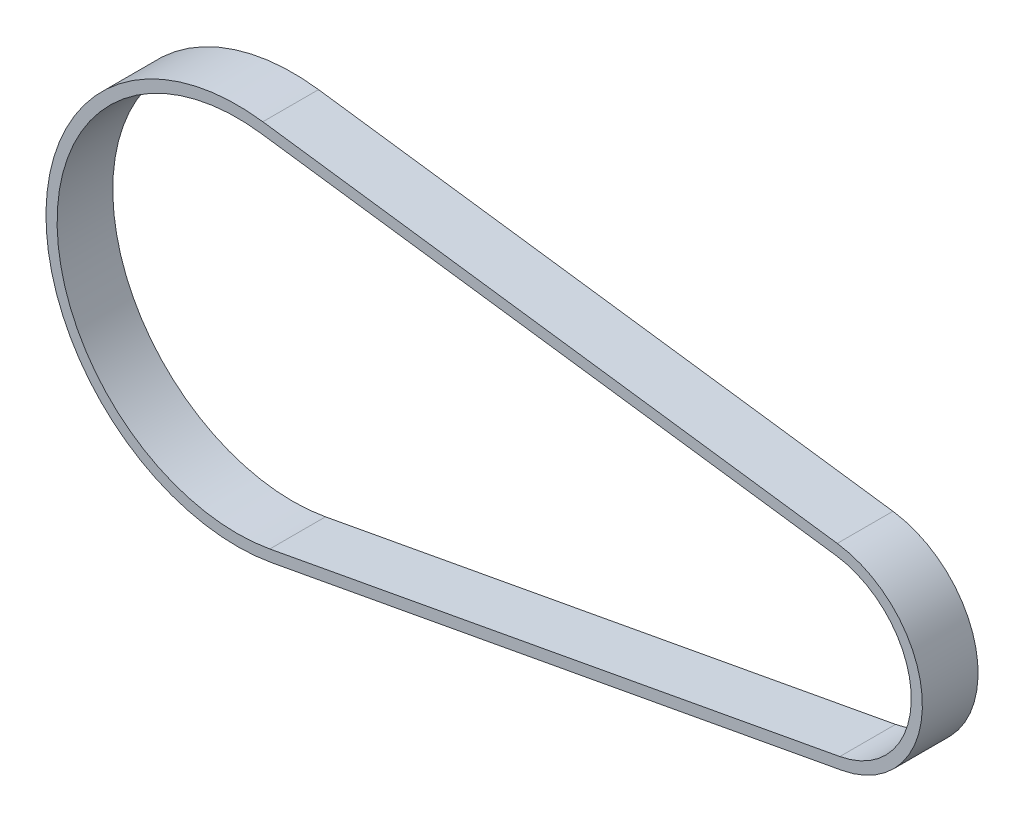
ISO-10303-21;
HEADER;
FILE_DESCRIPTION(('STEP AP214'),'2;1');
FILE_NAME('part.step','',(''),(''),'','','');
FILE_SCHEMA(('AUTOMOTIVE_DESIGN { 1 0 10303 214 1 1 1 1 }'));
ENDSEC;
DATA;
#1=APPLICATION_CONTEXT('core data for automotive mechanical design processes');
#2=APPLICATION_PROTOCOL_DEFINITION('international standard','automotive_design',2000,#1);
#3=PRODUCT_CONTEXT('',#1,'mechanical');
#4=PRODUCT('Part','Part','',(#3));
#5=PRODUCT_RELATED_PRODUCT_CATEGORY('part','',(#4));
#6=PRODUCT_DEFINITION_FORMATION('','',#4);
#7=PRODUCT_DEFINITION_CONTEXT('part definition',#1,'design');
#8=PRODUCT_DEFINITION('design','',#6,#7);
#9=PRODUCT_DEFINITION_SHAPE('','',#8);
#10=(LENGTH_UNIT() NAMED_UNIT(*) SI_UNIT(.MILLI.,.METRE.));
#11=(NAMED_UNIT(*) PLANE_ANGLE_UNIT() SI_UNIT($,.RADIAN.));
#12=(NAMED_UNIT(*) SI_UNIT($,.STERADIAN.) SOLID_ANGLE_UNIT());
#13=UNCERTAINTY_MEASURE_WITH_UNIT(LENGTH_MEASURE(1.E-05),#10,'distance_accuracy_value','');
#14=(GEOMETRIC_REPRESENTATION_CONTEXT(3) GLOBAL_UNCERTAINTY_ASSIGNED_CONTEXT((#13)) GLOBAL_UNIT_ASSIGNED_CONTEXT((#10,
#11,#12)) REPRESENTATION_CONTEXT('',''));
#15=CARTESIAN_POINT('',(0.,0.,0.));
#16=DIRECTION('',(0.,0.,1.));
#17=DIRECTION('',(1.,0.,0.));
#18=AXIS2_PLACEMENT_3D('',#15,#16,#17);
#19=CARTESIAN_POINT('',(158.094484339544,3.76760186596419,-7.5));
#20=DIRECTION('',(0.,0.,1.));
#21=DIRECTION('',(1.,0.,0.));
#22=AXIS2_PLACEMENT_3D('',#19,#20,#21);
#23=CYLINDRICAL_SURFACE('',#22,26.5);
#24=DIRECTION('',(0.,0.,1.));
#25=VECTOR('',#24,1.);
#26=CARTESIAN_POINT('',(161.65922604677,30.0267453508679,-7.5));
#27=LINE('',#26,#25);
#28=CARTESIAN_POINT('',(161.65922604677,30.0267453508679,-7.5));
#29=VERTEX_POINT('',#28);
#30=CARTESIAN_POINT('',(161.65922604677,30.0267453508679,7.5));
#31=VERTEX_POINT('',#30);
#32=EDGE_CURVE('E38',#29,#31,#27,.T.);
#33=ORIENTED_EDGE('',*,*,#32,.T.);
#34=CARTESIAN_POINT('',(158.094484339544,3.76760186596419,7.5));
#35=DIRECTION('',(0.,0.,1.));
#36=DIRECTION('',(1.,0.,0.));
#37=AXIS2_PLACEMENT_3D('',#34,#35,#36);
#38=CIRCLE('',#37,26.5);
#39=CARTESIAN_POINT('',(162.906049512127,-22.2919230834663,7.5));
#40=VERTEX_POINT('',#39);
#41=EDGE_CURVE('E130',#40,#31,#38,.T.);
#42=ORIENTED_EDGE('',*,*,#41,.F.);
#43=DIRECTION('',(0.,0.,1.));
#44=VECTOR('',#43,1.);
#45=CARTESIAN_POINT('',(162.906049512127,-22.2919230834663,-7.5));
#46=LINE('',#45,#44);
#47=CARTESIAN_POINT('',(162.906049512127,-22.2919230834663,-7.5));
#48=VERTEX_POINT('',#47);
#49=EDGE_CURVE('E11',#48,#40,#46,.T.);
#50=ORIENTED_EDGE('',*,*,#49,.F.);
#51=CARTESIAN_POINT('',(158.094484339544,3.76760186596419,-7.5));
#52=DIRECTION('',(0.,0.,1.));
#53=DIRECTION('',(1.,0.,0.));
#54=AXIS2_PLACEMENT_3D('',#51,#52,#53);
#55=CIRCLE('',#54,26.5);
#56=EDGE_CURVE('E149',#48,#29,#55,.T.);
#57=ORIENTED_EDGE('',*,*,#56,.T.);
#58=EDGE_LOOP('',(#33,#42,#50,#57));
#59=FACE_BOUND('',#58,.T.);
#60=ADVANCED_FACE('F35',(#59),#23,.T.);
#61=CARTESIAN_POINT('',(9.35077759954806,-50.6439824488931,-7.5));
#62=DIRECTION('',(0.181568497078603,-0.983378299978506,0.));
#63=DIRECTION('',(0.983378299978507,0.181568497078603,0.));
#64=AXIS2_PLACEMENT_3D('',#61,#62,#63);
#65=PLANE('',#64);
#66=ORIENTED_EDGE('',*,*,#49,.T.);
#67=DIRECTION('',(0.983378299978506,0.181568497078603,0.));
#68=VECTOR('',#67,1.);
#69=CARTESIAN_POINT('',(9.35077759954806,-50.6439824488931,7.5));
#70=LINE('',#69,#68);
#71=CARTESIAN_POINT('',(9.35077759954805,-50.6439824488931,7.5));
#72=VERTEX_POINT('',#71);
#73=EDGE_CURVE('E139',#72,#40,#70,.T.);
#74=ORIENTED_EDGE('',*,*,#73,.F.);
#75=DIRECTION('',(0.,0.,1.));
#76=VECTOR('',#75,1.);
#77=CARTESIAN_POINT('',(9.35077759954805,-50.6439824488931,-7.5));
#78=LINE('',#77,#76);
#79=CARTESIAN_POINT('',(9.35077759954805,-50.6439824488931,-7.5));
#80=VERTEX_POINT('',#79);
#81=EDGE_CURVE('E43',#80,#72,#78,.T.);
#82=ORIENTED_EDGE('',*,*,#81,.F.);
#83=DIRECTION('',(0.983378299978506,0.181568497078603,0.));
#84=VECTOR('',#83,1.);
#85=CARTESIAN_POINT('',(9.35077759954806,-50.6439824488931,-7.5));
#86=LINE('',#85,#84);
#87=EDGE_CURVE('E160',#80,#48,#86,.T.);
#88=ORIENTED_EDGE('',*,*,#87,.T.);
#89=EDGE_LOOP('',(#66,#74,#82,#88));
#90=FACE_BOUND('',#89,.T.);
#91=ADVANCED_FACE('F172',(#90),#65,.T.);
#92=CARTESIAN_POINT('',(0.,0.,-7.5));
#93=DIRECTION('',(0.,0.,1.));
#94=DIRECTION('',(1.,0.,0.));
#95=AXIS2_PLACEMENT_3D('',#92,#93,#94);
#96=CYLINDRICAL_SURFACE('',#95,51.5);
#97=ORIENTED_EDGE('',*,*,#81,.T.);
#98=CARTESIAN_POINT('',(0.,0.,7.5));
#99=DIRECTION('',(0.,0.,1.));
#100=DIRECTION('',(1.,0.,0.));
#101=AXIS2_PLACEMENT_3D('',#98,#99,#100);
#102=CIRCLE('',#101,51.5);
#103=CARTESIAN_POINT('',(6.9277055819687,51.0319203574543,7.5));
#104=VERTEX_POINT('',#103);
#105=EDGE_CURVE('E136',#104,#72,#102,.T.);
#106=ORIENTED_EDGE('',*,*,#105,.F.);
#107=DIRECTION('',(0.,0.,1.));
#108=VECTOR('',#107,1.);
#109=CARTESIAN_POINT('',(6.9277055819687,51.0319203574543,-7.5));
#110=LINE('',#109,#108);
#111=CARTESIAN_POINT('',(6.9277055819687,51.0319203574543,-7.5));
#112=VERTEX_POINT('',#111);
#113=EDGE_CURVE('E163',#112,#104,#110,.T.);
#114=ORIENTED_EDGE('',*,*,#113,.F.);
#115=CARTESIAN_POINT('',(0.,0.,-7.5));
#116=DIRECTION('',(0.,0.,1.));
#117=DIRECTION('',(1.,0.,0.));
#118=AXIS2_PLACEMENT_3D('',#115,#116,#117);
#119=CIRCLE('',#118,51.5);
#120=EDGE_CURVE('E157',#112,#80,#119,.T.);
#121=ORIENTED_EDGE('',*,*,#120,.T.);
#122=EDGE_LOOP('',(#97,#106,#114,#121));
#123=FACE_BOUND('',#122,.T.);
#124=ADVANCED_FACE('F178',(#123),#96,.T.);
#125=CARTESIAN_POINT('',(161.65922604677,30.0267453508679,-7.5));
#126=DIRECTION('',(0.134518554989683,0.990911074902025,0.));
#127=DIRECTION('',(-0.990911074902026,0.134518554989683,0.));
#128=AXIS2_PLACEMENT_3D('',#125,#126,#127);
#129=PLANE('',#128);
#130=ORIENTED_EDGE('',*,*,#113,.T.);
#131=DIRECTION('',(-0.990911074902025,0.134518554989683,0.));
#132=VECTOR('',#131,1.);
#133=CARTESIAN_POINT('',(161.65922604677,30.0267453508679,7.5));
#134=LINE('',#133,#132);
#135=EDGE_CURVE('E133',#31,#104,#134,.T.);
#136=ORIENTED_EDGE('',*,*,#135,.F.);
#137=ORIENTED_EDGE('',*,*,#32,.F.);
#138=DIRECTION('',(-0.990911074902025,0.134518554989683,0.));
#139=VECTOR('',#138,1.);
#140=CARTESIAN_POINT('',(161.65922604677,30.0267453508679,-7.5));
#141=LINE('',#140,#139);
#142=EDGE_CURVE('E154',#29,#112,#141,.T.);
#143=ORIENTED_EDGE('',*,*,#142,.T.);
#144=EDGE_LOOP('',(#130,#136,#137,#143));
#145=FACE_BOUND('',#144,.T.);
#146=ADVANCED_FACE('F167',(#145),#129,.T.);
#147=CARTESIAN_POINT('',(158.094484339544,3.76760186596419,-7.5));
#148=DIRECTION('',(0.,0.,1.));
#149=DIRECTION('',(1.,0.,0.));
#150=AXIS2_PLACEMENT_3D('',#147,#148,#149);
#151=PLANE('',#150);
#152=DIRECTION('',(0.983378299978506,0.181568497078603,0.));
#153=VECTOR('',#152,1.);
#154=CARTESIAN_POINT('',(8.80607210831225,-47.6938475489576,-7.5));
#155=LINE('',#154,#153);
#156=CARTESIAN_POINT('',(8.80607210831225,-47.6938475489576,-7.5));
#157=VERTEX_POINT('',#156);
#158=CARTESIAN_POINT('',(162.361344020891,-19.3417881835307,-7.5));
#159=VERTEX_POINT('',#158);
#160=EDGE_CURVE('E112',#157,#159,#155,.T.);
#161=ORIENTED_EDGE('',*,*,#160,.T.);
#162=CARTESIAN_POINT('',(158.094484339544,3.76760186596423,-7.5));
#163=DIRECTION('',(0.,0.,1.));
#164=DIRECTION('',(1.,0.,0.));
#165=AXIS2_PLACEMENT_3D('',#162,#163,#164);
#166=CIRCLE('',#165,23.5);
#167=CARTESIAN_POINT('',(161.255670381801,27.0540121261618,-7.5));
#168=VERTEX_POINT('',#167);
#169=EDGE_CURVE('E142',#159,#168,#166,.T.);
#170=ORIENTED_EDGE('',*,*,#169,.T.);
#171=DIRECTION('',(-0.990911074902025,0.134518554989683,0.));
#172=VECTOR('',#171,1.);
#173=CARTESIAN_POINT('',(161.255670381801,27.0540121261618,-7.5));
#174=LINE('',#173,#172);
#175=CARTESIAN_POINT('',(6.52414991699965,48.0591871327482,-7.5));
#176=VERTEX_POINT('',#175);
#177=EDGE_CURVE('E107',#168,#176,#174,.T.);
#178=ORIENTED_EDGE('',*,*,#177,.T.);
#179=CARTESIAN_POINT('',(0.,0.,-7.5));
#180=DIRECTION('',(0.,0.,1.));
#181=DIRECTION('',(1.,0.,0.));
#182=AXIS2_PLACEMENT_3D('',#179,#180,#181);
#183=CIRCLE('',#182,48.5);
#184=EDGE_CURVE('E51',#176,#157,#183,.T.);
#185=ORIENTED_EDGE('',*,*,#184,.T.);
#186=EDGE_LOOP('',(#161,#170,#178,#185));
#187=FACE_BOUND('',#186,.T.);
#188=ORIENTED_EDGE('',*,*,#56,.F.);
#189=ORIENTED_EDGE('',*,*,#87,.F.);
#190=ORIENTED_EDGE('',*,*,#120,.F.);
#191=ORIENTED_EDGE('',*,*,#142,.F.);
#192=EDGE_LOOP('',(#188,#189,#190,#191));
#193=FACE_BOUND('',#192,.T.);
#194=ADVANCED_FACE('F176',(#187,#193),#151,.F.);
#195=CARTESIAN_POINT('',(158.094484339544,3.76760186596423,-7.5));
#196=DIRECTION('',(0.,0.,1.));
#197=DIRECTION('',(1.,0.,0.));
#198=AXIS2_PLACEMENT_3D('',#195,#196,#197);
#199=CYLINDRICAL_SURFACE('',#198,23.5);
#200=DIRECTION('',(0.,0.,1.));
#201=VECTOR('',#200,1.);
#202=CARTESIAN_POINT('',(162.361344020891,-19.3417881835307,-7.5));
#203=LINE('',#202,#201);
#204=CARTESIAN_POINT('',(162.361344020891,-19.3417881835307,7.5));
#205=VERTEX_POINT('',#204);
#206=EDGE_CURVE('E117',#159,#205,#203,.T.);
#207=ORIENTED_EDGE('',*,*,#206,.T.);
#208=CARTESIAN_POINT('',(158.094484339544,3.76760186596423,7.5));
#209=DIRECTION('',(0.,0.,1.));
#210=DIRECTION('',(1.,0.,0.));
#211=AXIS2_PLACEMENT_3D('',#208,#209,#210);
#212=CIRCLE('',#211,23.5);
#213=CARTESIAN_POINT('',(161.255670381801,27.0540121261618,7.5));
#214=VERTEX_POINT('',#213);
#215=EDGE_CURVE('E115',#205,#214,#212,.T.);
#216=ORIENTED_EDGE('',*,*,#215,.T.);
#217=DIRECTION('',(0.,0.,1.));
#218=VECTOR('',#217,1.);
#219=CARTESIAN_POINT('',(161.255670381801,27.0540121261618,-7.5));
#220=LINE('',#219,#218);
#221=EDGE_CURVE('E100',#168,#214,#220,.T.);
#222=ORIENTED_EDGE('',*,*,#221,.F.);
#223=ORIENTED_EDGE('',*,*,#169,.F.);
#224=EDGE_LOOP('',(#207,#216,#222,#223));
#225=FACE_BOUND('',#224,.T.);
#226=ADVANCED_FACE('F116',(#225),#199,.F.);
#227=CARTESIAN_POINT('',(8.80607210831225,-47.6938475489576,-7.5));
#228=DIRECTION('',(0.181568497078603,-0.983378299978506,0.));
#229=DIRECTION('',(0.983378299978507,0.181568497078603,0.));
#230=AXIS2_PLACEMENT_3D('',#227,#228,#229);
#231=PLANE('',#230);
#232=DIRECTION('',(0.,0.,1.));
#233=VECTOR('',#232,1.);
#234=CARTESIAN_POINT('',(8.80607210831225,-47.6938475489576,-7.5));
#235=LINE('',#234,#233);
#236=CARTESIAN_POINT('',(8.80607210831225,-47.6938475489576,7.5));
#237=VERTEX_POINT('',#236);
#238=EDGE_CURVE('E150',#157,#237,#235,.T.);
#239=ORIENTED_EDGE('',*,*,#238,.T.);
#240=DIRECTION('',(0.983378299978506,0.181568497078603,0.));
#241=VECTOR('',#240,1.);
#242=CARTESIAN_POINT('',(8.80607210831225,-47.6938475489576,7.5));
#243=LINE('',#242,#241);
#244=EDGE_CURVE('E126',#237,#205,#243,.T.);
#245=ORIENTED_EDGE('',*,*,#244,.T.);
#246=ORIENTED_EDGE('',*,*,#206,.F.);
#247=ORIENTED_EDGE('',*,*,#160,.F.);
#248=EDGE_LOOP('',(#239,#245,#246,#247));
#249=FACE_BOUND('',#248,.T.);
#250=ADVANCED_FACE('F221',(#249),#231,.F.);
#251=CARTESIAN_POINT('',(0.,0.,-7.5));
#252=DIRECTION('',(0.,0.,1.));
#253=DIRECTION('',(1.,0.,0.));
#254=AXIS2_PLACEMENT_3D('',#251,#252,#253);
#255=CYLINDRICAL_SURFACE('',#254,48.5);
#256=DIRECTION('',(0.,0.,1.));
#257=VECTOR('',#256,1.);
#258=CARTESIAN_POINT('',(6.52414991699965,48.0591871327482,-7.5));
#259=LINE('',#258,#257);
#260=CARTESIAN_POINT('',(6.52414991699965,48.0591871327482,7.5));
#261=VERTEX_POINT('',#260);
#262=EDGE_CURVE('E111',#176,#261,#259,.T.);
#263=ORIENTED_EDGE('',*,*,#262,.T.);
#264=CARTESIAN_POINT('',(0.,0.,7.5));
#265=DIRECTION('',(0.,0.,1.));
#266=DIRECTION('',(1.,0.,0.));
#267=AXIS2_PLACEMENT_3D('',#264,#265,#266);
#268=CIRCLE('',#267,48.5);
#269=EDGE_CURVE('E124',#261,#237,#268,.T.);
#270=ORIENTED_EDGE('',*,*,#269,.T.);
#271=ORIENTED_EDGE('',*,*,#238,.F.);
#272=ORIENTED_EDGE('',*,*,#184,.F.);
#273=EDGE_LOOP('',(#263,#270,#271,#272));
#274=FACE_BOUND('',#273,.T.);
#275=ADVANCED_FACE('F230',(#274),#255,.F.);
#276=CARTESIAN_POINT('',(161.255670381801,27.0540121261618,-7.5));
#277=DIRECTION('',(0.134518554989683,0.990911074902025,0.));
#278=DIRECTION('',(-0.990911074902026,0.134518554989683,0.));
#279=AXIS2_PLACEMENT_3D('',#276,#277,#278);
#280=PLANE('',#279);
#281=ORIENTED_EDGE('',*,*,#221,.T.);
#282=DIRECTION('',(-0.990911074902025,0.134518554989683,0.));
#283=VECTOR('',#282,1.);
#284=CARTESIAN_POINT('',(161.255670381801,27.0540121261618,7.5));
#285=LINE('',#284,#283);
#286=EDGE_CURVE('E104',#214,#261,#285,.T.);
#287=ORIENTED_EDGE('',*,*,#286,.T.);
#288=ORIENTED_EDGE('',*,*,#262,.F.);
#289=ORIENTED_EDGE('',*,*,#177,.F.);
#290=EDGE_LOOP('',(#281,#287,#288,#289));
#291=FACE_BOUND('',#290,.T.);
#292=ADVANCED_FACE('F102',(#291),#280,.F.);
#293=CARTESIAN_POINT('',(158.094484339544,3.76760186596419,7.5));
#294=DIRECTION('',(0.,0.,1.));
#295=DIRECTION('',(1.,0.,0.));
#296=AXIS2_PLACEMENT_3D('',#293,#294,#295);
#297=PLANE('',#296);
#298=ORIENTED_EDGE('',*,*,#41,.T.);
#299=ORIENTED_EDGE('',*,*,#135,.T.);
#300=ORIENTED_EDGE('',*,*,#105,.T.);
#301=ORIENTED_EDGE('',*,*,#73,.T.);
#302=EDGE_LOOP('',(#298,#299,#300,#301));
#303=FACE_BOUND('',#302,.T.);
#304=ORIENTED_EDGE('',*,*,#286,.F.);
#305=ORIENTED_EDGE('',*,*,#215,.F.);
#306=ORIENTED_EDGE('',*,*,#244,.F.);
#307=ORIENTED_EDGE('',*,*,#269,.F.);
#308=EDGE_LOOP('',(#304,#305,#306,#307));
#309=FACE_BOUND('',#308,.T.);
#310=ADVANCED_FACE('F122',(#303,#309),#297,.T.);
#311=CLOSED_SHELL('',(#60,#91,#124,#146,#194,#226,#250,#275,#292,#310));
#312=MANIFOLD_SOLID_BREP('B2',#311);
#313=ADVANCED_BREP_SHAPE_REPRESENTATION('',(#18,#312),#14);
#314=SHAPE_DEFINITION_REPRESENTATION(#9,#313);
ENDSEC;
END-ISO-10303-21;
